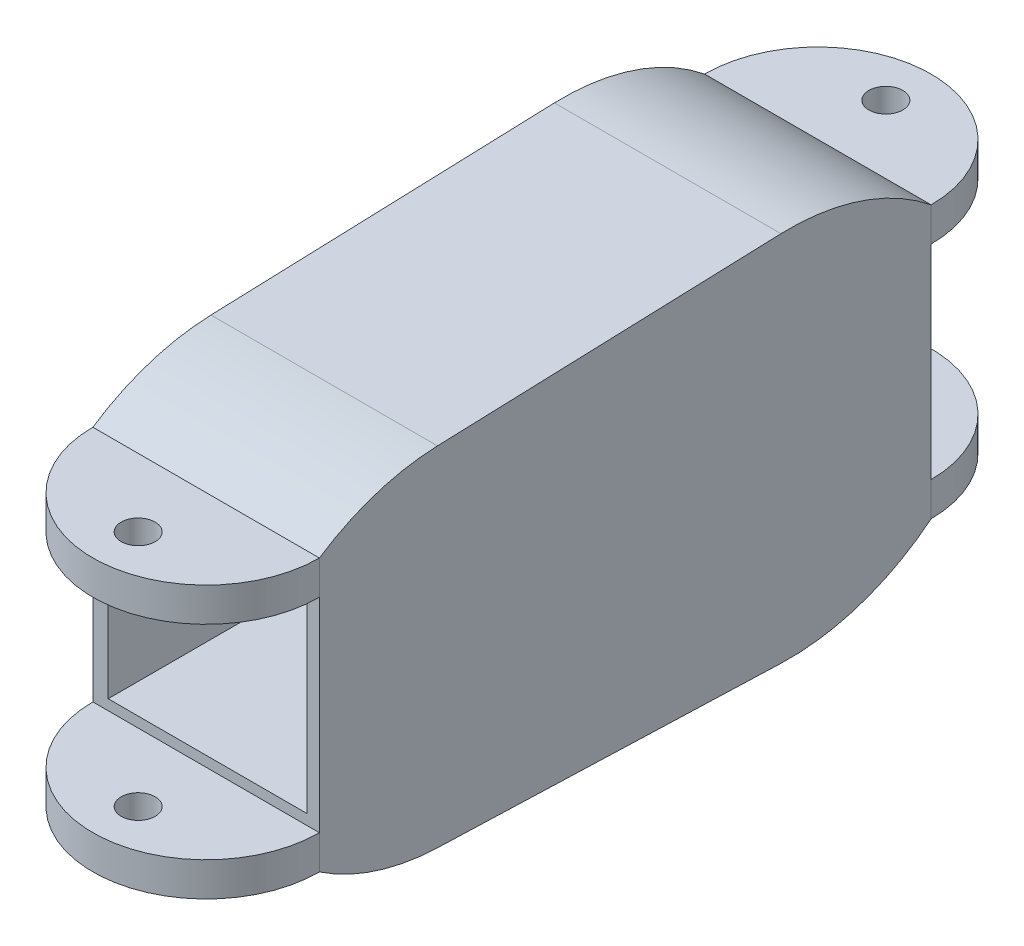
ISO-10303-21;
HEADER;
FILE_DESCRIPTION(('STEP AP214'),'2;1');
FILE_NAME('part.step','',(''),(''),'','','');
FILE_SCHEMA(('AUTOMOTIVE_DESIGN { 1 0 10303 214 1 1 1 1 }'));
ENDSEC;
DATA;
#1=APPLICATION_CONTEXT('core data for automotive mechanical design processes');
#2=APPLICATION_PROTOCOL_DEFINITION('international standard','automotive_design',2000,#1);
#3=PRODUCT_CONTEXT('',#1,'mechanical');
#4=PRODUCT('Part','Part','',(#3));
#5=PRODUCT_RELATED_PRODUCT_CATEGORY('part','',(#4));
#6=PRODUCT_DEFINITION_FORMATION('','',#4);
#7=PRODUCT_DEFINITION_CONTEXT('part definition',#1,'design');
#8=PRODUCT_DEFINITION('design','',#6,#7);
#9=PRODUCT_DEFINITION_SHAPE('','',#8);
#10=(LENGTH_UNIT() NAMED_UNIT(*) SI_UNIT(.MILLI.,.METRE.));
#11=(NAMED_UNIT(*) PLANE_ANGLE_UNIT() SI_UNIT($,.RADIAN.));
#12=(NAMED_UNIT(*) SI_UNIT($,.STERADIAN.) SOLID_ANGLE_UNIT());
#13=UNCERTAINTY_MEASURE_WITH_UNIT(LENGTH_MEASURE(1.E-05),#10,'distance_accuracy_value','');
#14=(GEOMETRIC_REPRESENTATION_CONTEXT(3) GLOBAL_UNCERTAINTY_ASSIGNED_CONTEXT((#13)) GLOBAL_UNIT_ASSIGNED_CONTEXT((#10,
#11,#12)) REPRESENTATION_CONTEXT('',''));
#15=CARTESIAN_POINT('',(0.,0.,0.));
#16=DIRECTION('',(0.,0.,1.));
#17=DIRECTION('',(1.,0.,0.));
#18=AXIS2_PLACEMENT_3D('',#15,#16,#17);
#19=CARTESIAN_POINT('',(0.,-6.,-13.5));
#20=DIRECTION('',(0.,-1.,0.));
#21=DIRECTION('',(0.,0.,-1.));
#22=AXIS2_PLACEMENT_3D('',#19,#20,#21);
#23=PLANE('',#22);
#24=CARTESIAN_POINT('',(5.,-6.,16.5));
#25=DIRECTION('',(0.,-1.,0.));
#26=DIRECTION('',(0.,0.,-1.));
#27=AXIS2_PLACEMENT_3D('',#24,#25,#26);
#28=CIRCLE('',#27,0.75);
#29=CARTESIAN_POINT('',(5.,-6.,15.75));
#30=VERTEX_POINT('',#29);
#31=EDGE_CURVE('E291',#30,#30,#28,.F.);
#32=ORIENTED_EDGE('',*,*,#31,.T.);
#33=EDGE_LOOP('',(#32));
#34=FACE_BOUND('',#33,.T.);
#35=DIRECTION('',(-1.,0.,0.));
#36=VECTOR('',#35,1.);
#37=CARTESIAN_POINT('',(0.,-6.,13.5));
#38=LINE('',#37,#36);
#39=CARTESIAN_POINT('',(0.,-6.,13.5));
#40=VERTEX_POINT('',#39);
#41=CARTESIAN_POINT('',(10.,-6.,13.5));
#42=VERTEX_POINT('',#41);
#43=EDGE_CURVE('E283',#40,#42,#38,.F.);
#44=ORIENTED_EDGE('',*,*,#43,.T.);
#45=CARTESIAN_POINT('',(5.,-6.,13.5));
#46=DIRECTION('',(0.,-1.,0.));
#47=DIRECTION('',(0.,0.,-1.));
#48=AXIS2_PLACEMENT_3D('',#45,#46,#47);
#49=CIRCLE('',#48,5.);
#50=EDGE_CURVE('E295',#40,#42,#49,.F.);
#51=ORIENTED_EDGE('',*,*,#50,.F.);
#52=EDGE_LOOP('',(#44,#51));
#53=FACE_BOUND('',#52,.T.);
#54=ADVANCED_FACE('F35',(#34,#53),#23,.T.);
#55=CARTESIAN_POINT('',(5.,1.85709225775E-11,-13.5));
#56=DIRECTION('',(0.,1.,0.));
#57=DIRECTION('',(0.,0.,1.));
#58=AXIS2_PLACEMENT_3D('',#55,#56,#57);
#59=CYLINDRICAL_SURFACE('',#58,5.);
#60=CARTESIAN_POINT('',(5.,-6.,-13.5));
#61=DIRECTION('',(0.,1.,0.));
#62=DIRECTION('',(0.,0.,1.));
#63=AXIS2_PLACEMENT_3D('',#60,#61,#62);
#64=CIRCLE('',#63,5.);
#65=CARTESIAN_POINT('',(0.,-6.,-13.5));
#66=VERTEX_POINT('',#65);
#67=CARTESIAN_POINT('',(10.,-6.,-13.5));
#68=VERTEX_POINT('',#67);
#69=EDGE_CURVE('E280',#66,#68,#64,.F.);
#70=ORIENTED_EDGE('',*,*,#69,.F.);
#71=DIRECTION('',(0.,1.,0.));
#72=VECTOR('',#71,1.);
#73=CARTESIAN_POINT('',(0.,1.85709225775E-11,-13.5));
#74=LINE('',#73,#72);
#75=CARTESIAN_POINT('',(0.,-4.5,-13.5));
#76=VERTEX_POINT('',#75);
#77=EDGE_CURVE('E325',#66,#76,#74,.T.);
#78=ORIENTED_EDGE('',*,*,#77,.T.);
#79=CARTESIAN_POINT('',(5.,-4.5,-13.5));
#80=DIRECTION('',(0.,1.,0.));
#81=DIRECTION('',(0.,0.,1.));
#82=AXIS2_PLACEMENT_3D('',#79,#80,#81);
#83=CIRCLE('',#82,5.);
#84=CARTESIAN_POINT('',(10.,-4.5,-13.5));
#85=VERTEX_POINT('',#84);
#86=EDGE_CURVE('E274',#85,#76,#83,.T.);
#87=ORIENTED_EDGE('',*,*,#86,.F.);
#88=DIRECTION('',(0.,1.,0.));
#89=VECTOR('',#88,1.);
#90=CARTESIAN_POINT('',(10.,-2.42508235715E-11,-13.5));
#91=LINE('',#90,#89);
#92=EDGE_CURVE('E184',#85,#68,#91,.F.);
#93=ORIENTED_EDGE('',*,*,#92,.T.);
#94=EDGE_LOOP('',(#70,#78,#87,#93));
#95=FACE_BOUND('',#94,.T.);
#96=ADVANCED_FACE('F324',(#95),#59,.T.);
#97=CARTESIAN_POINT('',(5.,4.,-16.5));
#98=DIRECTION('',(0.,-1.,0.));
#99=DIRECTION('',(0.,0.,-1.));
#100=AXIS2_PLACEMENT_3D('',#97,#98,#99);
#101=CYLINDRICAL_SURFACE('',#100,0.75);
#102=CARTESIAN_POINT('',(5.,-6.,-16.5));
#103=DIRECTION('',(0.,-1.,0.));
#104=DIRECTION('',(0.,0.,-1.));
#105=AXIS2_PLACEMENT_3D('',#102,#103,#104);
#106=CIRCLE('',#105,0.75);
#107=CARTESIAN_POINT('',(5.,-6.,-17.25));
#108=VERTEX_POINT('',#107);
#109=EDGE_CURVE('E277',#108,#108,#106,.F.);
#110=ORIENTED_EDGE('',*,*,#109,.F.);
#111=EDGE_LOOP('',(#110));
#112=FACE_BOUND('',#111,.T.);
#113=CARTESIAN_POINT('',(5.,-4.5,-16.5));
#114=DIRECTION('',(0.,-1.,0.));
#115=DIRECTION('',(0.,0.,-1.));
#116=AXIS2_PLACEMENT_3D('',#113,#114,#115);
#117=CIRCLE('',#116,0.75);
#118=CARTESIAN_POINT('',(5.,-4.5,-17.25));
#119=VERTEX_POINT('',#118);
#120=EDGE_CURVE('E271',#119,#119,#117,.T.);
#121=ORIENTED_EDGE('',*,*,#120,.F.);
#122=EDGE_LOOP('',(#121));
#123=FACE_BOUND('',#122,.T.);
#124=ADVANCED_FACE('F490',(#112,#123),#101,.F.);
#125=CARTESIAN_POINT('',(5.,1.85709225775E-11,-13.5));
#126=DIRECTION('',(0.,1.,0.));
#127=DIRECTION('',(0.,0.,1.));
#128=AXIS2_PLACEMENT_3D('',#125,#126,#127);
#129=CYLINDRICAL_SURFACE('',#128,5.);
#130=CARTESIAN_POINT('',(5.,4.5,-13.5));
#131=DIRECTION('',(0.,1.,0.));
#132=DIRECTION('',(0.,0.,1.));
#133=AXIS2_PLACEMENT_3D('',#130,#131,#132);
#134=CIRCLE('',#133,5.);
#135=CARTESIAN_POINT('',(10.,4.5,-13.5));
#136=VERTEX_POINT('',#135);
#137=CARTESIAN_POINT('',(0.,4.5,-13.5));
#138=VERTEX_POINT('',#137);
#139=EDGE_CURVE('E268',#136,#138,#134,.T.);
#140=ORIENTED_EDGE('',*,*,#139,.T.);
#141=DIRECTION('',(0.,1.,0.));
#142=VECTOR('',#141,1.);
#143=CARTESIAN_POINT('',(0.,1.85709225775E-11,-13.5));
#144=LINE('',#143,#142);
#145=CARTESIAN_POINT('',(0.,6.,-13.5));
#146=VERTEX_POINT('',#145);
#147=EDGE_CURVE('E297',#138,#146,#144,.T.);
#148=ORIENTED_EDGE('',*,*,#147,.T.);
#149=CARTESIAN_POINT('',(5.,6.,-13.5));
#150=DIRECTION('',(0.,1.,0.));
#151=DIRECTION('',(0.,0.,1.));
#152=AXIS2_PLACEMENT_3D('',#149,#150,#151);
#153=CIRCLE('',#152,5.);
#154=CARTESIAN_POINT('',(10.,6.,-13.5));
#155=VERTEX_POINT('',#154);
#156=EDGE_CURVE('E262',#146,#155,#153,.F.);
#157=ORIENTED_EDGE('',*,*,#156,.T.);
#158=DIRECTION('',(0.,1.,0.));
#159=VECTOR('',#158,1.);
#160=CARTESIAN_POINT('',(10.,-2.42508235715E-11,-13.5));
#161=LINE('',#160,#159);
#162=EDGE_CURVE('E343',#155,#136,#161,.F.);
#163=ORIENTED_EDGE('',*,*,#162,.T.);
#164=EDGE_LOOP('',(#140,#148,#157,#163));
#165=FACE_BOUND('',#164,.T.);
#166=ADVANCED_FACE('F367',(#165),#129,.T.);
#167=CARTESIAN_POINT('',(5.,4.,-16.5));
#168=DIRECTION('',(0.,-1.,0.));
#169=DIRECTION('',(0.,0.,-1.));
#170=AXIS2_PLACEMENT_3D('',#167,#168,#169);
#171=CYLINDRICAL_SURFACE('',#170,0.75);
#172=CARTESIAN_POINT('',(5.,6.,-16.5));
#173=DIRECTION('',(0.,-1.,0.));
#174=DIRECTION('',(0.,0.,-1.));
#175=AXIS2_PLACEMENT_3D('',#172,#173,#174);
#176=CIRCLE('',#175,0.75);
#177=CARTESIAN_POINT('',(5.,6.,-17.25));
#178=VERTEX_POINT('',#177);
#179=EDGE_CURVE('E259',#178,#178,#176,.F.);
#180=ORIENTED_EDGE('',*,*,#179,.T.);
#181=EDGE_LOOP('',(#180));
#182=FACE_BOUND('',#181,.T.);
#183=CARTESIAN_POINT('',(5.,4.5,-16.5));
#184=DIRECTION('',(0.,-1.,0.));
#185=DIRECTION('',(0.,0.,-1.));
#186=AXIS2_PLACEMENT_3D('',#183,#184,#185);
#187=CIRCLE('',#186,0.75);
#188=CARTESIAN_POINT('',(5.,4.5,-17.25));
#189=VERTEX_POINT('',#188);
#190=EDGE_CURVE('E265',#189,#189,#187,.T.);
#191=ORIENTED_EDGE('',*,*,#190,.T.);
#192=EDGE_LOOP('',(#191));
#193=FACE_BOUND('',#192,.T.);
#194=ADVANCED_FACE('F523',(#182,#193),#171,.F.);
#195=CARTESIAN_POINT('',(0.,6.,-13.5));
#196=DIRECTION('',(0.,-1.,0.));
#197=DIRECTION('',(0.,0.,-1.));
#198=AXIS2_PLACEMENT_3D('',#195,#196,#197);
#199=PLANE('',#198);
#200=CARTESIAN_POINT('',(5.,6.,16.5));
#201=DIRECTION('',(0.,-1.,0.));
#202=DIRECTION('',(0.,0.,-1.));
#203=AXIS2_PLACEMENT_3D('',#200,#201,#202);
#204=CIRCLE('',#203,0.75);
#205=CARTESIAN_POINT('',(5.,6.,15.75));
#206=VERTEX_POINT('',#205);
#207=EDGE_CURVE('E284',#206,#206,#204,.T.);
#208=ORIENTED_EDGE('',*,*,#207,.T.);
#209=EDGE_LOOP('',(#208));
#210=FACE_BOUND('',#209,.T.);
#211=CARTESIAN_POINT('',(5.,6.,13.5));
#212=DIRECTION('',(0.,-1.,0.));
#213=DIRECTION('',(0.,0.,-1.));
#214=AXIS2_PLACEMENT_3D('',#211,#212,#213);
#215=CIRCLE('',#214,5.);
#216=CARTESIAN_POINT('',(10.,6.,13.5));
#217=VERTEX_POINT('',#216);
#218=CARTESIAN_POINT('',(0.,6.,13.5));
#219=VERTEX_POINT('',#218);
#220=EDGE_CURVE('E288',#217,#219,#215,.T.);
#221=ORIENTED_EDGE('',*,*,#220,.F.);
#222=DIRECTION('',(-1.,0.,0.));
#223=VECTOR('',#222,1.);
#224=CARTESIAN_POINT('',(0.,6.,13.5));
#225=LINE('',#224,#223);
#226=EDGE_CURVE('E216',#217,#219,#225,.T.);
#227=ORIENTED_EDGE('',*,*,#226,.T.);
#228=EDGE_LOOP('',(#221,#227));
#229=FACE_BOUND('',#228,.T.);
#230=ADVANCED_FACE('F544',(#210,#229),#199,.F.);
#231=CARTESIAN_POINT('',(5.,1.85709225775E-11,13.5));
#232=DIRECTION('',(0.,-1.,0.));
#233=DIRECTION('',(0.,0.,-1.));
#234=AXIS2_PLACEMENT_3D('',#231,#232,#233);
#235=CYLINDRICAL_SURFACE('',#234,5.);
#236=CARTESIAN_POINT('',(5.,-4.5,13.5));
#237=DIRECTION('',(0.,-1.,0.));
#238=DIRECTION('',(0.,0.,-1.));
#239=AXIS2_PLACEMENT_3D('',#236,#237,#238);
#240=CIRCLE('',#239,5.);
#241=CARTESIAN_POINT('',(0.,-4.5,13.5));
#242=VERTEX_POINT('',#241);
#243=CARTESIAN_POINT('',(10.,-4.5,13.5));
#244=VERTEX_POINT('',#243);
#245=EDGE_CURVE('E213',#242,#244,#240,.F.);
#246=ORIENTED_EDGE('',*,*,#245,.F.);
#247=DIRECTION('',(0.,-1.,0.));
#248=VECTOR('',#247,1.);
#249=CARTESIAN_POINT('',(0.,1.85709225775E-11,13.5));
#250=LINE('',#249,#248);
#251=EDGE_CURVE('E294',#242,#40,#250,.T.);
#252=ORIENTED_EDGE('',*,*,#251,.T.);
#253=ORIENTED_EDGE('',*,*,#50,.T.);
#254=DIRECTION('',(0.,1.,0.));
#255=VECTOR('',#254,1.);
#256=CARTESIAN_POINT('',(10.,0.,13.5));
#257=LINE('',#256,#255);
#258=EDGE_CURVE('E214',#244,#42,#257,.F.);
#259=ORIENTED_EDGE('',*,*,#258,.F.);
#260=EDGE_LOOP('',(#246,#252,#253,#259));
#261=FACE_BOUND('',#260,.T.);
#262=ADVANCED_FACE('F547',(#261),#235,.T.);
#263=CARTESIAN_POINT('',(5.,4.,16.5));
#264=DIRECTION('',(0.,-1.,0.));
#265=DIRECTION('',(0.,0.,-1.));
#266=AXIS2_PLACEMENT_3D('',#263,#264,#265);
#267=CYLINDRICAL_SURFACE('',#266,0.75);
#268=ORIENTED_EDGE('',*,*,#31,.F.);
#269=EDGE_LOOP('',(#268));
#270=FACE_BOUND('',#269,.T.);
#271=CARTESIAN_POINT('',(5.,-4.5,16.5));
#272=DIRECTION('',(0.,-1.,0.));
#273=DIRECTION('',(0.,0.,-1.));
#274=AXIS2_PLACEMENT_3D('',#271,#272,#273);
#275=CIRCLE('',#274,0.75);
#276=CARTESIAN_POINT('',(5.,-4.5,15.75));
#277=VERTEX_POINT('',#276);
#278=EDGE_CURVE('E255',#277,#277,#275,.T.);
#279=ORIENTED_EDGE('',*,*,#278,.F.);
#280=EDGE_LOOP('',(#279));
#281=FACE_BOUND('',#280,.T.);
#282=ADVANCED_FACE('F558',(#270,#281),#267,.F.);
#283=CARTESIAN_POINT('',(5.,1.85709225775E-11,13.5));
#284=DIRECTION('',(0.,-1.,0.));
#285=DIRECTION('',(0.,0.,-1.));
#286=AXIS2_PLACEMENT_3D('',#283,#284,#285);
#287=CYLINDRICAL_SURFACE('',#286,5.);
#288=ORIENTED_EDGE('',*,*,#220,.T.);
#289=DIRECTION('',(0.,-1.,0.));
#290=VECTOR('',#289,1.);
#291=CARTESIAN_POINT('',(0.,1.85709225775E-11,13.5));
#292=LINE('',#291,#290);
#293=CARTESIAN_POINT('',(0.,4.5,13.5));
#294=VERTEX_POINT('',#293);
#295=EDGE_CURVE('E287',#219,#294,#292,.T.);
#296=ORIENTED_EDGE('',*,*,#295,.T.);
#297=CARTESIAN_POINT('',(5.,4.5,13.5));
#298=DIRECTION('',(0.,-1.,0.));
#299=DIRECTION('',(0.,0.,-1.));
#300=AXIS2_PLACEMENT_3D('',#297,#298,#299);
#301=CIRCLE('',#300,5.);
#302=CARTESIAN_POINT('',(10.,4.5,13.5));
#303=VERTEX_POINT('',#302);
#304=EDGE_CURVE('E253',#294,#303,#301,.F.);
#305=ORIENTED_EDGE('',*,*,#304,.T.);
#306=DIRECTION('',(0.,1.,0.));
#307=VECTOR('',#306,1.);
#308=CARTESIAN_POINT('',(10.,0.,13.5));
#309=LINE('',#308,#307);
#310=EDGE_CURVE('E210',#217,#303,#309,.F.);
#311=ORIENTED_EDGE('',*,*,#310,.F.);
#312=EDGE_LOOP('',(#288,#296,#305,#311));
#313=FACE_BOUND('',#312,.T.);
#314=ADVANCED_FACE('F555',(#313),#287,.T.);
#315=CARTESIAN_POINT('',(5.,4.,16.5));
#316=DIRECTION('',(0.,-1.,0.));
#317=DIRECTION('',(0.,0.,-1.));
#318=AXIS2_PLACEMENT_3D('',#315,#316,#317);
#319=CYLINDRICAL_SURFACE('',#318,0.75);
#320=ORIENTED_EDGE('',*,*,#207,.F.);
#321=EDGE_LOOP('',(#320));
#322=FACE_BOUND('',#321,.T.);
#323=CARTESIAN_POINT('',(5.,4.5,16.5));
#324=DIRECTION('',(0.,-1.,0.));
#325=DIRECTION('',(0.,0.,-1.));
#326=AXIS2_PLACEMENT_3D('',#323,#324,#325);
#327=CIRCLE('',#326,0.75);
#328=CARTESIAN_POINT('',(5.,4.5,15.75));
#329=VERTEX_POINT('',#328);
#330=EDGE_CURVE('E195',#329,#329,#327,.T.);
#331=ORIENTED_EDGE('',*,*,#330,.T.);
#332=EDGE_LOOP('',(#331));
#333=FACE_BOUND('',#332,.T.);
#334=ADVANCED_FACE('F503',(#322,#333),#319,.F.);
#335=CARTESIAN_POINT('',(0.,-6.,-13.5));
#336=DIRECTION('',(0.,-1.,0.));
#337=DIRECTION('',(0.,0.,-1.));
#338=AXIS2_PLACEMENT_3D('',#335,#336,#337);
#339=PLANE('',#338);
#340=ORIENTED_EDGE('',*,*,#109,.T.);
#341=EDGE_LOOP('',(#340));
#342=FACE_BOUND('',#341,.T.);
#343=DIRECTION('',(-1.,0.,0.));
#344=VECTOR('',#343,1.);
#345=CARTESIAN_POINT('',(0.,-6.,-13.5));
#346=LINE('',#345,#344);
#347=EDGE_CURVE('E194',#66,#68,#346,.F.);
#348=ORIENTED_EDGE('',*,*,#347,.F.);
#349=ORIENTED_EDGE('',*,*,#69,.T.);
#350=EDGE_LOOP('',(#348,#349));
#351=FACE_BOUND('',#350,.T.);
#352=ADVANCED_FACE('F322',(#342,#351),#339,.T.);
#353=CARTESIAN_POINT('',(0.,-4.5,-18.5));
#354=DIRECTION('',(0.,1.,0.));
#355=DIRECTION('',(0.,0.,1.));
#356=AXIS2_PLACEMENT_3D('',#353,#354,#355);
#357=PLANE('',#356);
#358=ORIENTED_EDGE('',*,*,#120,.T.);
#359=EDGE_LOOP('',(#358));
#360=FACE_BOUND('',#359,.T.);
#361=DIRECTION('',(-1.,0.,0.));
#362=VECTOR('',#361,1.);
#363=CARTESIAN_POINT('',(0.,-4.5,-13.5));
#364=LINE('',#363,#362);
#365=EDGE_CURVE('E328',#85,#76,#364,.T.);
#366=ORIENTED_EDGE('',*,*,#365,.F.);
#367=ORIENTED_EDGE('',*,*,#86,.T.);
#368=EDGE_LOOP('',(#366,#367));
#369=FACE_BOUND('',#368,.T.);
#370=ADVANCED_FACE('F349',(#360,#369),#357,.T.);
#371=CARTESIAN_POINT('',(0.,4.5,-18.5));
#372=DIRECTION('',(0.,1.,0.));
#373=DIRECTION('',(0.,0.,1.));
#374=AXIS2_PLACEMENT_3D('',#371,#372,#373);
#375=PLANE('',#374);
#376=ORIENTED_EDGE('',*,*,#190,.F.);
#377=EDGE_LOOP('',(#376));
#378=FACE_BOUND('',#377,.T.);
#379=ORIENTED_EDGE('',*,*,#139,.F.);
#380=DIRECTION('',(-1.,0.,0.));
#381=VECTOR('',#380,1.);
#382=CARTESIAN_POINT('',(0.,4.5,-13.5));
#383=LINE('',#382,#381);
#384=EDGE_CURVE('E223',#138,#136,#383,.F.);
#385=ORIENTED_EDGE('',*,*,#384,.F.);
#386=EDGE_LOOP('',(#379,#385));
#387=FACE_BOUND('',#386,.T.);
#388=ADVANCED_FACE('F368',(#378,#387),#375,.F.);
#389=CARTESIAN_POINT('',(0.,6.,-13.5));
#390=DIRECTION('',(0.,-1.,0.));
#391=DIRECTION('',(0.,0.,-1.));
#392=AXIS2_PLACEMENT_3D('',#389,#390,#391);
#393=PLANE('',#392);
#394=ORIENTED_EDGE('',*,*,#179,.F.);
#395=EDGE_LOOP('',(#394));
#396=FACE_BOUND('',#395,.T.);
#397=DIRECTION('',(-1.,0.,0.));
#398=VECTOR('',#397,1.);
#399=CARTESIAN_POINT('',(0.,6.,-13.5));
#400=LINE('',#399,#398);
#401=EDGE_CURVE('E217',#155,#146,#400,.T.);
#402=ORIENTED_EDGE('',*,*,#401,.F.);
#403=ORIENTED_EDGE('',*,*,#156,.F.);
#404=EDGE_LOOP('',(#402,#403));
#405=FACE_BOUND('',#404,.T.);
#406=ADVANCED_FACE('F362',(#396,#405),#393,.F.);
#407=CARTESIAN_POINT('',(10.,0.,0.));
#408=DIRECTION('',(1.,0.,0.));
#409=DIRECTION('',(0.,0.,-1.));
#410=AXIS2_PLACEMENT_3D('',#407,#408,#409);
#411=PLANE('',#410);
#412=ORIENTED_EDGE('',*,*,#258,.T.);
#413=CARTESIAN_POINT('',(10.,2.31194219205457,7.94017833056283));
#414=DIRECTION('',(1.,0.,0.));
#415=DIRECTION('',(0.,0.,-1.));
#416=AXIS2_PLACEMENT_3D('',#413,#414,#415);
#417=CIRCLE('',#416,10.);
#418=CARTESIAN_POINT('',(10.,-7.68196607813639,8.28917329758786));
#419=VERTEX_POINT('',#418);
#420=EDGE_CURVE('E50',#42,#419,#417,.T.);
#421=ORIENTED_EDGE('',*,*,#420,.T.);
#422=DIRECTION('',(0.,-0.0348994967025033,-0.999390827019096));
#423=VECTOR('',#422,1.);
#424=CARTESIAN_POINT('',(10.,-7.5,13.5));
#425=LINE('',#424,#423);
#426=CARTESIAN_POINT('',(10.,-8.21138791765919,-6.87148459249316));
#427=VERTEX_POINT('',#426);
#428=EDGE_CURVE('E192',#427,#419,#425,.F.);
#429=ORIENTED_EDGE('',*,*,#428,.F.);
#430=CARTESIAN_POINT('',(10.,1.78252035253177,-7.22047955951819));
#431=DIRECTION('',(1.,0.,0.));
#432=DIRECTION('',(0.,0.,-1.));
#433=AXIS2_PLACEMENT_3D('',#430,#431,#432);
#434=CIRCLE('',#433,10.);
#435=EDGE_CURVE('E229',#427,#68,#434,.T.);
#436=ORIENTED_EDGE('',*,*,#435,.T.);
#437=ORIENTED_EDGE('',*,*,#92,.F.);
#438=DIRECTION('',(0.,1.,0.));
#439=VECTOR('',#438,1.);
#440=CARTESIAN_POINT('',(10.,-7.5,-13.5));
#441=LINE('',#440,#439);
#442=EDGE_CURVE('E220',#136,#85,#441,.F.);
#443=ORIENTED_EDGE('',*,*,#442,.F.);
#444=ORIENTED_EDGE('',*,*,#162,.F.);
#445=CARTESIAN_POINT('',(10.,-1.78252035253177,-7.22047955951819));
#446=DIRECTION('',(1.,0.,0.));
#447=DIRECTION('',(0.,0.,-1.));
#448=AXIS2_PLACEMENT_3D('',#445,#446,#447);
#449=CIRCLE('',#448,10.);
#450=CARTESIAN_POINT('',(10.,8.21138791765919,-6.87148459249316));
#451=VERTEX_POINT('',#450);
#452=EDGE_CURVE('E231',#155,#451,#449,.T.);
#453=ORIENTED_EDGE('',*,*,#452,.T.);
#454=DIRECTION('',(0.,0.0348994967025033,-0.999390827019096));
#455=VECTOR('',#454,1.);
#456=CARTESIAN_POINT('',(10.,7.5,13.5));
#457=LINE('',#456,#455);
#458=CARTESIAN_POINT('',(10.,7.68196607813639,8.28917329758786));
#459=VERTEX_POINT('',#458);
#460=EDGE_CURVE('E207',#451,#459,#457,.F.);
#461=ORIENTED_EDGE('',*,*,#460,.T.);
#462=CARTESIAN_POINT('',(10.,-2.31194219205457,7.94017833056283));
#463=DIRECTION('',(1.,0.,0.));
#464=DIRECTION('',(0.,0.,-1.));
#465=AXIS2_PLACEMENT_3D('',#462,#463,#464);
#466=CIRCLE('',#465,10.);
#467=EDGE_CURVE('E241',#459,#217,#466,.T.);
#468=ORIENTED_EDGE('',*,*,#467,.T.);
#469=ORIENTED_EDGE('',*,*,#310,.T.);
#470=DIRECTION('',(0.,1.,0.));
#471=VECTOR('',#470,1.);
#472=CARTESIAN_POINT('',(10.,6.,13.5));
#473=LINE('',#472,#471);
#474=EDGE_CURVE('E204',#303,#244,#473,.F.);
#475=ORIENTED_EDGE('',*,*,#474,.T.);
#476=EDGE_LOOP('',(#412,#421,#429,#436,#437,#443,#444,#453,#461,#468,#469,#475));
#477=FACE_BOUND('',#476,.T.);
#478=ADVANCED_FACE('F313',(#477),#411,.T.);
#479=CARTESIAN_POINT('',(0.,-4.5,-18.5));
#480=DIRECTION('',(0.,1.,0.));
#481=DIRECTION('',(0.,0.,1.));
#482=AXIS2_PLACEMENT_3D('',#479,#480,#481);
#483=PLANE('',#482);
#484=ORIENTED_EDGE('',*,*,#278,.T.);
#485=EDGE_LOOP('',(#484));
#486=FACE_BOUND('',#485,.T.);
#487=DIRECTION('',(-1.,0.,0.));
#488=VECTOR('',#487,1.);
#489=CARTESIAN_POINT('',(0.,-4.5,13.5));
#490=LINE('',#489,#488);
#491=EDGE_CURVE('E203',#244,#242,#490,.T.);
#492=ORIENTED_EDGE('',*,*,#491,.T.);
#493=ORIENTED_EDGE('',*,*,#245,.T.);
#494=EDGE_LOOP('',(#492,#493));
#495=FACE_BOUND('',#494,.T.);
#496=ADVANCED_FACE('F410',(#486,#495),#483,.T.);
#497=CARTESIAN_POINT('',(0.,4.5,-18.5));
#498=DIRECTION('',(0.,1.,0.));
#499=DIRECTION('',(0.,0.,1.));
#500=AXIS2_PLACEMENT_3D('',#497,#498,#499);
#501=PLANE('',#500);
#502=ORIENTED_EDGE('',*,*,#330,.F.);
#503=EDGE_LOOP('',(#502));
#504=FACE_BOUND('',#503,.T.);
#505=DIRECTION('',(-1.,0.,0.));
#506=VECTOR('',#505,1.);
#507=CARTESIAN_POINT('',(0.,4.5,13.5));
#508=LINE('',#507,#506);
#509=EDGE_CURVE('E199',#294,#303,#508,.F.);
#510=ORIENTED_EDGE('',*,*,#509,.T.);
#511=ORIENTED_EDGE('',*,*,#304,.F.);
#512=EDGE_LOOP('',(#510,#511));
#513=FACE_BOUND('',#512,.T.);
#514=ADVANCED_FACE('F407',(#504,#513),#501,.F.);
#515=CARTESIAN_POINT('',(5.,-7.5,13.5));
#516=DIRECTION('',(0.,-0.999390827019096,0.0348994967025033));
#517=DIRECTION('',(0.,-0.0348994967025033,-0.999390827019096));
#518=AXIS2_PLACEMENT_3D('',#515,#516,#517);
#519=PLANE('',#518);
#520=ORIENTED_EDGE('',*,*,#428,.T.);
#521=DIRECTION('',(1.,0.,0.));
#522=VECTOR('',#521,1.);
#523=CARTESIAN_POINT('',(0.,-7.68196607813639,8.28917329758786));
#524=LINE('',#523,#522);
#525=CARTESIAN_POINT('',(0.,-7.68196607813868,8.28917329759267));
#526=VERTEX_POINT('',#525);
#527=EDGE_CURVE('E243',#419,#526,#524,.F.);
#528=ORIENTED_EDGE('',*,*,#527,.T.);
#529=DIRECTION('',(0.,-0.0348994967029746,-0.999390827019079));
#530=VECTOR('',#529,1.);
#531=CARTESIAN_POINT('',(0.,-7.5,13.5));
#532=LINE('',#531,#530);
#533=CARTESIAN_POINT('',(0.,-8.2113879176688,-6.87148459249282));
#534=VERTEX_POINT('',#533);
#535=EDGE_CURVE('E202',#526,#534,#532,.T.);
#536=ORIENTED_EDGE('',*,*,#535,.T.);
#537=DIRECTION('',(1.,0.,0.));
#538=VECTOR('',#537,1.);
#539=CARTESIAN_POINT('',(10.,-8.21138791765919,-6.87148459249316));
#540=LINE('',#539,#538);
#541=EDGE_CURVE('E308',#534,#427,#540,.T.);
#542=ORIENTED_EDGE('',*,*,#541,.T.);
#543=EDGE_LOOP('',(#520,#528,#536,#542));
#544=FACE_BOUND('',#543,.T.);
#545=ADVANCED_FACE('F404',(#544),#519,.T.);
#546=CARTESIAN_POINT('',(0.,-7.5,-13.5));
#547=DIRECTION('',(0.,0.,-1.));
#548=DIRECTION('',(-1.,0.,0.));
#549=AXIS2_PLACEMENT_3D('',#546,#547,#548);
#550=PLANE('',#549);
#551=DIRECTION('',(0.,-1.,0.));
#552=VECTOR('',#551,1.);
#553=CARTESIAN_POINT('',(9.44185902029322,4.04024059451799,-13.5));
#554=LINE('',#553,#552);
#555=CARTESIAN_POINT('',(9.44185902029322,4.04024059451799,-13.5));
#556=VERTEX_POINT('',#555);
#557=CARTESIAN_POINT('',(9.44185902029322,-4.04016251686646,-13.5));
#558=VERTEX_POINT('',#557);
#559=EDGE_CURVE('E172',#556,#558,#554,.T.);
#560=ORIENTED_EDGE('',*,*,#559,.F.);
#561=DIRECTION('',(1.,0.,0.));
#562=VECTOR('',#561,1.);
#563=CARTESIAN_POINT('',(9.44185902029322,4.04024059451799,-13.5));
#564=LINE('',#563,#562);
#565=CARTESIAN_POINT('',(0.676275528118851,4.04024059451799,-13.5));
#566=VERTEX_POINT('',#565);
#567=EDGE_CURVE('E177',#566,#556,#564,.T.);
#568=ORIENTED_EDGE('',*,*,#567,.F.);
#569=DIRECTION('',(0.,1.,0.));
#570=VECTOR('',#569,1.);
#571=CARTESIAN_POINT('',(0.676275528118851,4.04024059451799,-13.5));
#572=LINE('',#571,#570);
#573=CARTESIAN_POINT('',(0.676275528118851,-4.04016251686646,-13.5));
#574=VERTEX_POINT('',#573);
#575=EDGE_CURVE('E156',#574,#566,#572,.T.);
#576=ORIENTED_EDGE('',*,*,#575,.F.);
#577=DIRECTION('',(-1.,0.,0.));
#578=VECTOR('',#577,1.);
#579=CARTESIAN_POINT('',(9.44185902029322,-4.04016251686646,-13.5));
#580=LINE('',#579,#578);
#581=EDGE_CURVE('E167',#558,#574,#580,.T.);
#582=ORIENTED_EDGE('',*,*,#581,.F.);
#583=EDGE_LOOP('',(#560,#568,#576,#582));
#584=FACE_BOUND('',#583,.T.);
#585=ORIENTED_EDGE('',*,*,#384,.T.);
#586=ORIENTED_EDGE('',*,*,#442,.T.);
#587=ORIENTED_EDGE('',*,*,#365,.T.);
#588=DIRECTION('',(0.,1.,0.));
#589=VECTOR('',#588,1.);
#590=CARTESIAN_POINT('',(0.,0.,-13.5));
#591=LINE('',#590,#589);
#592=EDGE_CURVE('E191',#76,#138,#591,.T.);
#593=ORIENTED_EDGE('',*,*,#592,.T.);
#594=EDGE_LOOP('',(#585,#586,#587,#593));
#595=FACE_BOUND('',#594,.T.);
#596=ADVANCED_FACE('F174',(#584,#595),#550,.T.);
#597=CARTESIAN_POINT('',(5.,7.5,13.5));
#598=DIRECTION('',(0.,-0.999390827019096,-0.0348994967025033));
#599=DIRECTION('',(0.,0.0348994967025033,-0.999390827019096));
#600=AXIS2_PLACEMENT_3D('',#597,#598,#599);
#601=PLANE('',#600);
#602=DIRECTION('',(0.,-0.0348994967044534,0.999390827019027));
#603=VECTOR('',#602,1.);
#604=CARTESIAN_POINT('',(0.,8.44286077633,-13.5));
#605=LINE('',#604,#603);
#606=CARTESIAN_POINT('',(0.,8.21138791769826,-6.87148459247227));
#607=VERTEX_POINT('',#606);
#608=CARTESIAN_POINT('',(0.,7.68196607814656,8.28917329758822));
#609=VERTEX_POINT('',#608);
#610=EDGE_CURVE('E187',#607,#609,#605,.T.);
#611=ORIENTED_EDGE('',*,*,#610,.T.);
#612=DIRECTION('',(-1.,0.,0.));
#613=VECTOR('',#612,1.);
#614=CARTESIAN_POINT('',(5.,7.68196607813639,8.28917329758786));
#615=LINE('',#614,#613);
#616=EDGE_CURVE('E239',#609,#459,#615,.F.);
#617=ORIENTED_EDGE('',*,*,#616,.T.);
#618=ORIENTED_EDGE('',*,*,#460,.F.);
#619=DIRECTION('',(-1.,0.,0.));
#620=VECTOR('',#619,1.);
#621=CARTESIAN_POINT('',(5.,8.21138791765919,-6.87148459249316));
#622=LINE('',#621,#620);
#623=EDGE_CURVE('E233',#451,#607,#622,.T.);
#624=ORIENTED_EDGE('',*,*,#623,.T.);
#625=EDGE_LOOP('',(#611,#617,#618,#624));
#626=FACE_BOUND('',#625,.T.);
#627=ADVANCED_FACE('F393',(#626),#601,.F.);
#628=CARTESIAN_POINT('',(0.,6.,13.5));
#629=DIRECTION('',(0.,0.,-1.));
#630=DIRECTION('',(-1.,0.,0.));
#631=AXIS2_PLACEMENT_3D('',#628,#629,#630);
#632=PLANE('',#631);
#633=DIRECTION('',(1.,0.,0.));
#634=VECTOR('',#633,1.);
#635=CARTESIAN_POINT('',(0.,4.04024059451799,13.5));
#636=LINE('',#635,#634);
#637=CARTESIAN_POINT('',(0.676275528118851,4.04024059451799,13.5));
#638=VERTEX_POINT('',#637);
#639=CARTESIAN_POINT('',(9.44185902029322,4.04024059451799,13.5));
#640=VERTEX_POINT('',#639);
#641=EDGE_CURVE('E300',#638,#640,#636,.T.);
#642=ORIENTED_EDGE('',*,*,#641,.T.);
#643=DIRECTION('',(0.,-1.,0.));
#644=VECTOR('',#643,1.);
#645=CARTESIAN_POINT('',(9.44185902029322,6.,13.5));
#646=LINE('',#645,#644);
#647=CARTESIAN_POINT('',(9.44185902029322,-4.04016251686646,13.5));
#648=VERTEX_POINT('',#647);
#649=EDGE_CURVE('E303',#640,#648,#646,.T.);
#650=ORIENTED_EDGE('',*,*,#649,.T.);
#651=DIRECTION('',(-1.,0.,0.));
#652=VECTOR('',#651,1.);
#653=CARTESIAN_POINT('',(0.,-4.04016251686646,13.5));
#654=LINE('',#653,#652);
#655=CARTESIAN_POINT('',(0.676275528118851,-4.04016251686646,13.5));
#656=VERTEX_POINT('',#655);
#657=EDGE_CURVE('E198',#648,#656,#654,.T.);
#658=ORIENTED_EDGE('',*,*,#657,.T.);
#659=DIRECTION('',(0.,1.,0.));
#660=VECTOR('',#659,1.);
#661=CARTESIAN_POINT('',(0.676275528118851,6.,13.5));
#662=LINE('',#661,#660);
#663=EDGE_CURVE('E159',#656,#638,#662,.T.);
#664=ORIENTED_EDGE('',*,*,#663,.T.);
#665=EDGE_LOOP('',(#642,#650,#658,#664));
#666=FACE_BOUND('',#665,.T.);
#667=DIRECTION('',(0.,1.,0.));
#668=VECTOR('',#667,1.);
#669=CARTESIAN_POINT('',(0.,0.,13.5));
#670=LINE('',#669,#668);
#671=EDGE_CURVE('E190',#294,#242,#670,.F.);
#672=ORIENTED_EDGE('',*,*,#671,.T.);
#673=ORIENTED_EDGE('',*,*,#491,.F.);
#674=ORIENTED_EDGE('',*,*,#474,.F.);
#675=ORIENTED_EDGE('',*,*,#509,.F.);
#676=EDGE_LOOP('',(#672,#673,#674,#675));
#677=FACE_BOUND('',#676,.T.);
#678=ADVANCED_FACE('F383',(#666,#677),#632,.F.);
#679=CARTESIAN_POINT('',(0.,0.,0.));
#680=DIRECTION('',(1.,0.,0.));
#681=DIRECTION('',(0.,0.,-1.));
#682=AXIS2_PLACEMENT_3D('',#679,#680,#681);
#683=PLANE('',#682);
#684=CARTESIAN_POINT('',(0.,0.,0.));
#685=DIRECTION('',(1.,0.,0.));
#686=DIRECTION('',(0.,0.,-1.));
#687=AXIS2_PLACEMENT_3D('',#684,#685,#686);
#688=CIRCLE('',#687,2.08951873679029);
#689=CARTESIAN_POINT('',(0.,0.,-2.08951873679029));
#690=VERTEX_POINT('',#689);
#691=EDGE_CURVE('E11',#690,#690,#688,.F.);
#692=ORIENTED_EDGE('',*,*,#691,.F.);
#693=EDGE_LOOP('',(#692));
#694=FACE_BOUND('',#693,.T.);
#695=ORIENTED_EDGE('',*,*,#535,.F.);
#696=CARTESIAN_POINT('',(0.,2.31194219205457,7.94017833056283));
#697=DIRECTION('',(1.,0.,0.));
#698=DIRECTION('',(0.,0.,-1.));
#699=AXIS2_PLACEMENT_3D('',#696,#697,#698);
#700=CIRCLE('',#699,10.);
#701=EDGE_CURVE('E58',#526,#40,#700,.F.);
#702=ORIENTED_EDGE('',*,*,#701,.T.);
#703=ORIENTED_EDGE('',*,*,#251,.F.);
#704=ORIENTED_EDGE('',*,*,#671,.F.);
#705=ORIENTED_EDGE('',*,*,#295,.F.);
#706=CARTESIAN_POINT('',(0.,-2.31194219205457,7.94017833056283));
#707=DIRECTION('',(1.,0.,0.));
#708=DIRECTION('',(0.,0.,-1.));
#709=AXIS2_PLACEMENT_3D('',#706,#707,#708);
#710=CIRCLE('',#709,10.);
#711=EDGE_CURVE('E237',#219,#609,#710,.F.);
#712=ORIENTED_EDGE('',*,*,#711,.T.);
#713=ORIENTED_EDGE('',*,*,#610,.F.);
#714=CARTESIAN_POINT('',(0.,-1.78252035253177,-7.22047955951819));
#715=DIRECTION('',(1.,0.,0.));
#716=DIRECTION('',(0.,0.,-1.));
#717=AXIS2_PLACEMENT_3D('',#714,#715,#716);
#718=CIRCLE('',#717,10.);
#719=EDGE_CURVE('E235',#607,#146,#718,.F.);
#720=ORIENTED_EDGE('',*,*,#719,.T.);
#721=ORIENTED_EDGE('',*,*,#147,.F.);
#722=ORIENTED_EDGE('',*,*,#592,.F.);
#723=ORIENTED_EDGE('',*,*,#77,.F.);
#724=CARTESIAN_POINT('',(0.,1.78252035253177,-7.22047955951819));
#725=DIRECTION('',(1.,0.,0.));
#726=DIRECTION('',(0.,0.,-1.));
#727=AXIS2_PLACEMENT_3D('',#724,#725,#726);
#728=CIRCLE('',#727,10.);
#729=EDGE_CURVE('E306',#66,#534,#728,.F.);
#730=ORIENTED_EDGE('',*,*,#729,.T.);
#731=EDGE_LOOP('',(#695,#702,#703,#704,#705,#712,#713,#720,#721,#722,#723,#730));
#732=FACE_BOUND('',#731,.T.);
#733=ADVANCED_FACE('F353',(#694,#732),#683,.F.);
#734=CARTESIAN_POINT('',(9.44185902029322,4.04024059451799,19.5));
#735=DIRECTION('',(1.,0.,0.));
#736=DIRECTION('',(0.,0.,-1.));
#737=AXIS2_PLACEMENT_3D('',#734,#735,#736);
#738=PLANE('',#737);
#739=CARTESIAN_POINT('',(9.44185902029322,0.,0.329426052928738));
#740=DIRECTION('',(1.,0.,0.));
#741=DIRECTION('',(0.,0.,-1.));
#742=AXIS2_PLACEMENT_3D('',#739,#740,#741);
#743=CIRCLE('',#742,2.00057543443948);
#744=CARTESIAN_POINT('',(9.44185902029322,0.,-1.67114938151075));
#745=VERTEX_POINT('',#744);
#746=EDGE_CURVE('E43',#745,#745,#743,.F.);
#747=ORIENTED_EDGE('',*,*,#746,.F.);
#748=EDGE_LOOP('',(#747));
#749=FACE_BOUND('',#748,.T.);
#750=DIRECTION('',(0.,0.,-1.));
#751=VECTOR('',#750,1.);
#752=CARTESIAN_POINT('',(9.44185902029322,4.04024059451799,19.5));
#753=LINE('',#752,#751);
#754=EDGE_CURVE('E182',#640,#556,#753,.T.);
#755=ORIENTED_EDGE('',*,*,#754,.T.);
#756=ORIENTED_EDGE('',*,*,#559,.T.);
#757=DIRECTION('',(0.,0.,-1.));
#758=VECTOR('',#757,1.);
#759=CARTESIAN_POINT('',(9.44185902029322,-4.04016251686646,19.5));
#760=LINE('',#759,#758);
#761=EDGE_CURVE('E163',#648,#558,#760,.T.);
#762=ORIENTED_EDGE('',*,*,#761,.F.);
#763=ORIENTED_EDGE('',*,*,#649,.F.);
#764=EDGE_LOOP('',(#755,#756,#762,#763));
#765=FACE_BOUND('',#764,.T.);
#766=ADVANCED_FACE('F382',(#749,#765),#738,.F.);
#767=CARTESIAN_POINT('',(9.44185902029322,4.04024059451799,19.5));
#768=DIRECTION('',(0.,1.,0.));
#769=DIRECTION('',(0.,0.,1.));
#770=AXIS2_PLACEMENT_3D('',#767,#768,#769);
#771=PLANE('',#770);
#772=DIRECTION('',(0.,0.,-1.));
#773=VECTOR('',#772,1.);
#774=CARTESIAN_POINT('',(0.676275528118851,4.04024059451799,19.5));
#775=LINE('',#774,#773);
#776=EDGE_CURVE('E162',#638,#566,#775,.T.);
#777=ORIENTED_EDGE('',*,*,#776,.T.);
#778=ORIENTED_EDGE('',*,*,#567,.T.);
#779=ORIENTED_EDGE('',*,*,#754,.F.);
#780=ORIENTED_EDGE('',*,*,#641,.F.);
#781=EDGE_LOOP('',(#777,#778,#779,#780));
#782=FACE_BOUND('',#781,.T.);
#783=ADVANCED_FACE('F390',(#782),#771,.F.);
#784=CARTESIAN_POINT('',(0.676275528118851,4.04024059451799,19.5));
#785=DIRECTION('',(-1.,0.,0.));
#786=DIRECTION('',(0.,0.,1.));
#787=AXIS2_PLACEMENT_3D('',#784,#785,#786);
#788=PLANE('',#787);
#789=DIRECTION('',(0.,0.,-1.));
#790=VECTOR('',#789,1.);
#791=CARTESIAN_POINT('',(0.676275528118851,-4.04016251686646,19.5));
#792=LINE('',#791,#790);
#793=EDGE_CURVE('E151',#656,#574,#792,.T.);
#794=ORIENTED_EDGE('',*,*,#793,.T.);
#795=ORIENTED_EDGE('',*,*,#575,.T.);
#796=ORIENTED_EDGE('',*,*,#776,.F.);
#797=ORIENTED_EDGE('',*,*,#663,.F.);
#798=EDGE_LOOP('',(#794,#795,#796,#797));
#799=FACE_BOUND('',#798,.T.);
#800=ADVANCED_FACE('F153',(#799),#788,.F.);
#801=CARTESIAN_POINT('',(9.44185902029322,-4.04016251686646,19.5));
#802=DIRECTION('',(0.,-1.,0.));
#803=DIRECTION('',(0.,0.,-1.));
#804=AXIS2_PLACEMENT_3D('',#801,#802,#803);
#805=PLANE('',#804);
#806=ORIENTED_EDGE('',*,*,#761,.T.);
#807=ORIENTED_EDGE('',*,*,#581,.T.);
#808=ORIENTED_EDGE('',*,*,#793,.F.);
#809=ORIENTED_EDGE('',*,*,#657,.F.);
#810=EDGE_LOOP('',(#806,#807,#808,#809));
#811=FACE_BOUND('',#810,.T.);
#812=ADVANCED_FACE('F168',(#811),#805,.F.);
#813=CARTESIAN_POINT('',(0.,1.78252035253177,-7.22047955951819));
#814=DIRECTION('',(-1.,0.,0.));
#815=DIRECTION('',(0.,0.,1.));
#816=AXIS2_PLACEMENT_3D('',#813,#814,#815);
#817=CYLINDRICAL_SURFACE('',#816,10.);
#818=ORIENTED_EDGE('',*,*,#435,.F.);
#819=ORIENTED_EDGE('',*,*,#541,.F.);
#820=ORIENTED_EDGE('',*,*,#729,.F.);
#821=ORIENTED_EDGE('',*,*,#347,.T.);
#822=EDGE_LOOP('',(#818,#819,#820,#821));
#823=FACE_BOUND('',#822,.T.);
#824=ADVANCED_FACE('F326',(#823),#817,.T.);
#825=CARTESIAN_POINT('',(0.,-1.78252035253177,-7.22047955951819));
#826=DIRECTION('',(-1.,0.,0.));
#827=DIRECTION('',(0.,0.,1.));
#828=AXIS2_PLACEMENT_3D('',#825,#826,#827);
#829=CYLINDRICAL_SURFACE('',#828,10.);
#830=ORIENTED_EDGE('',*,*,#719,.F.);
#831=ORIENTED_EDGE('',*,*,#623,.F.);
#832=ORIENTED_EDGE('',*,*,#452,.F.);
#833=ORIENTED_EDGE('',*,*,#401,.T.);
#834=EDGE_LOOP('',(#830,#831,#832,#833));
#835=FACE_BOUND('',#834,.T.);
#836=ADVANCED_FACE('F365',(#835),#829,.T.);
#837=CARTESIAN_POINT('',(0.,-2.31194219205457,7.94017833056283));
#838=DIRECTION('',(-1.,0.,0.));
#839=DIRECTION('',(0.,0.,1.));
#840=AXIS2_PLACEMENT_3D('',#837,#838,#839);
#841=CYLINDRICAL_SURFACE('',#840,10.);
#842=ORIENTED_EDGE('',*,*,#467,.F.);
#843=ORIENTED_EDGE('',*,*,#616,.F.);
#844=ORIENTED_EDGE('',*,*,#711,.F.);
#845=ORIENTED_EDGE('',*,*,#226,.F.);
#846=EDGE_LOOP('',(#842,#843,#844,#845));
#847=FACE_BOUND('',#846,.T.);
#848=ADVANCED_FACE('F537',(#847),#841,.T.);
#849=CARTESIAN_POINT('',(0.,2.31194219205457,7.94017833056283));
#850=DIRECTION('',(-1.,0.,0.));
#851=DIRECTION('',(0.,0.,1.));
#852=AXIS2_PLACEMENT_3D('',#849,#850,#851);
#853=CYLINDRICAL_SURFACE('',#852,10.);
#854=ORIENTED_EDGE('',*,*,#420,.F.);
#855=ORIENTED_EDGE('',*,*,#43,.F.);
#856=ORIENTED_EDGE('',*,*,#701,.F.);
#857=ORIENTED_EDGE('',*,*,#527,.F.);
#858=EDGE_LOOP('',(#854,#855,#856,#857));
#859=FACE_BOUND('',#858,.T.);
#860=ADVANCED_FACE('F37',(#859),#853,.T.);
#861=CARTESIAN_POINT('',(6.44185902029322,0.,0.329426052928738));
#862=DIRECTION('',(1.,0.,0.));
#863=DIRECTION('',(0.,0.,-1.));
#864=AXIS2_PLACEMENT_3D('',#861,#862,#863);
#865=CYLINDRICAL_SURFACE('',#864,2.00057543443948);
#866=CARTESIAN_POINT('',(6.44185902029322,0.,0.329426052928738));
#867=DIRECTION('',(-1.,0.,0.));
#868=DIRECTION('',(0.,0.,1.));
#869=AXIS2_PLACEMENT_3D('',#866,#867,#868);
#870=CIRCLE('',#869,2.00057543443948);
#871=CARTESIAN_POINT('',(6.44185902029322,0.,2.33000148736822));
#872=VERTEX_POINT('',#871);
#873=EDGE_CURVE('E617',#872,#872,#870,.T.);
#874=ORIENTED_EDGE('',*,*,#873,.F.);
#875=EDGE_LOOP('',(#874));
#876=FACE_BOUND('',#875,.T.);
#877=ORIENTED_EDGE('',*,*,#746,.T.);
#878=EDGE_LOOP('',(#877));
#879=FACE_BOUND('',#878,.T.);
#880=ADVANCED_FACE('F590',(#876,#879),#865,.T.);
#881=CARTESIAN_POINT('',(6.44185902029322,0.,0.329426052928738));
#882=DIRECTION('',(-1.,0.,0.));
#883=DIRECTION('',(0.,0.,1.));
#884=AXIS2_PLACEMENT_3D('',#881,#882,#883);
#885=PLANE('',#884);
#886=ORIENTED_EDGE('',*,*,#873,.T.);
#887=EDGE_LOOP('',(#886));
#888=FACE_BOUND('',#887,.T.);
#889=ADVANCED_FACE('F630',(#888),#885,.T.);
#890=CARTESIAN_POINT('',(-3.,0.,0.));
#891=DIRECTION('',(1.,0.,0.));
#892=DIRECTION('',(0.,0.,-1.));
#893=AXIS2_PLACEMENT_3D('',#890,#891,#892);
#894=CYLINDRICAL_SURFACE('',#893,2.08951873679029);
#895=CARTESIAN_POINT('',(-3.,0.,0.));
#896=DIRECTION('',(-1.,0.,0.));
#897=DIRECTION('',(0.,0.,1.));
#898=AXIS2_PLACEMENT_3D('',#895,#896,#897);
#899=CIRCLE('',#898,2.08951873679029);
#900=CARTESIAN_POINT('',(-3.,0.,2.08951873679029));
#901=VERTEX_POINT('',#900);
#902=EDGE_CURVE('E619',#901,#901,#899,.T.);
#903=ORIENTED_EDGE('',*,*,#902,.F.);
#904=EDGE_LOOP('',(#903));
#905=FACE_BOUND('',#904,.T.);
#906=ORIENTED_EDGE('',*,*,#691,.T.);
#907=EDGE_LOOP('',(#906));
#908=FACE_BOUND('',#907,.T.);
#909=ADVANCED_FACE('F627',(#905,#908),#894,.T.);
#910=CARTESIAN_POINT('',(-3.,0.,0.));
#911=DIRECTION('',(-1.,0.,0.));
#912=DIRECTION('',(0.,0.,1.));
#913=AXIS2_PLACEMENT_3D('',#910,#911,#912);
#914=PLANE('',#913);
#915=ORIENTED_EDGE('',*,*,#902,.T.);
#916=EDGE_LOOP('',(#915));
#917=FACE_BOUND('',#916,.T.);
#918=ADVANCED_FACE('F625',(#917),#914,.T.);
#919=CLOSED_SHELL('',(#54,#96,#124,#166,#194,#230,#262,#282,#314,#334,#352,#370,#388,#406,#478,
#496,#514,#545,#596,#627,#678,#733,#766,#783,#800,#812,#824,#836,#848,#860,#880,#889,#909,#918));
#920=MANIFOLD_SOLID_BREP('B2',#919);
#921=ADVANCED_BREP_SHAPE_REPRESENTATION('',(#18,#920),#14);
#922=SHAPE_DEFINITION_REPRESENTATION(#9,#921);
ENDSEC;
END-ISO-10303-21;
